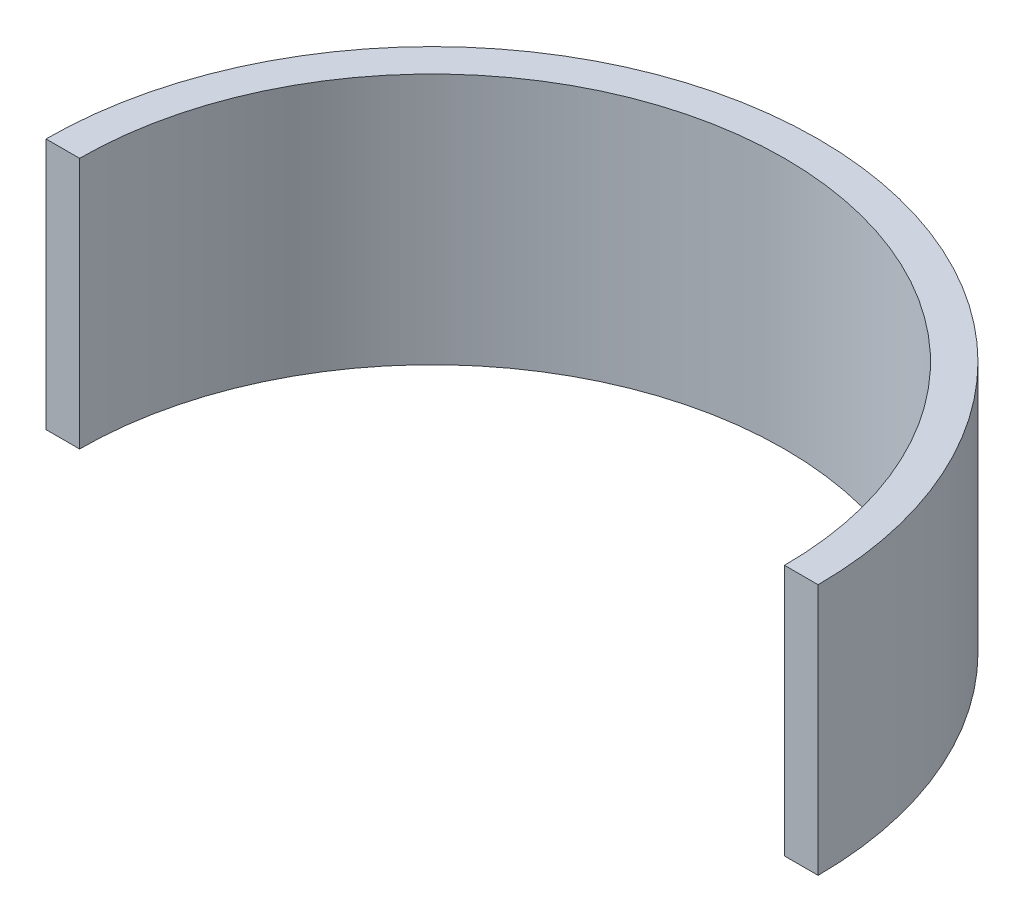
ISO-10303-21;
HEADER;
FILE_DESCRIPTION(('STEP AP214'),'2;1');
FILE_NAME('part.step','',(''),(''),'','','');
FILE_SCHEMA(('AUTOMOTIVE_DESIGN { 1 0 10303 214 1 1 1 1 }'));
ENDSEC;
DATA;
#1=APPLICATION_CONTEXT('core data for automotive mechanical design processes');
#2=APPLICATION_PROTOCOL_DEFINITION('international standard','automotive_design',2000,#1);
#3=PRODUCT_CONTEXT('',#1,'mechanical');
#4=PRODUCT('Part','Part','',(#3));
#5=PRODUCT_RELATED_PRODUCT_CATEGORY('part','',(#4));
#6=PRODUCT_DEFINITION_FORMATION('','',#4);
#7=PRODUCT_DEFINITION_CONTEXT('part definition',#1,'design');
#8=PRODUCT_DEFINITION('design','',#6,#7);
#9=PRODUCT_DEFINITION_SHAPE('','',#8);
#10=(LENGTH_UNIT() NAMED_UNIT(*) SI_UNIT(.MILLI.,.METRE.));
#11=(NAMED_UNIT(*) PLANE_ANGLE_UNIT() SI_UNIT($,.RADIAN.));
#12=(NAMED_UNIT(*) SI_UNIT($,.STERADIAN.) SOLID_ANGLE_UNIT());
#13=UNCERTAINTY_MEASURE_WITH_UNIT(LENGTH_MEASURE(1.E-05),#10,'distance_accuracy_value','');
#14=(GEOMETRIC_REPRESENTATION_CONTEXT(3) GLOBAL_UNCERTAINTY_ASSIGNED_CONTEXT((#13)) GLOBAL_UNIT_ASSIGNED_CONTEXT((#10,
#11,#12)) REPRESENTATION_CONTEXT('',''));
#15=CARTESIAN_POINT('',(0.,0.,0.));
#16=DIRECTION('',(0.,0.,1.));
#17=DIRECTION('',(1.,0.,0.));
#18=AXIS2_PLACEMENT_3D('',#15,#16,#17);
#19=CARTESIAN_POINT('',(0.,30.,0.));
#20=DIRECTION('',(0.,-1.,0.));
#21=DIRECTION('',(0.,0.,-1.));
#22=AXIS2_PLACEMENT_3D('',#19,#20,#21);
#23=CYLINDRICAL_SURFACE('',#22,46.);
#24=CARTESIAN_POINT('',(0.,0.,0.));
#25=DIRECTION('',(0.,1.,0.));
#26=DIRECTION('',(0.,0.,-1.));
#27=AXIS2_PLACEMENT_3D('',#24,#25,#26);
#28=CIRCLE('',#27,46.);
#29=CARTESIAN_POINT('',(46.,0.,0.));
#30=VERTEX_POINT('',#29);
#31=CARTESIAN_POINT('',(-46.,0.,0.));
#32=VERTEX_POINT('',#31);
#33=EDGE_CURVE('E107',#30,#32,#28,.T.);
#34=ORIENTED_EDGE('',*,*,#33,.T.);
#35=DIRECTION('',(0.,-1.,0.));
#36=VECTOR('',#35,1.);
#37=CARTESIAN_POINT('',(-46.,30.,0.));
#38=LINE('',#37,#36);
#39=CARTESIAN_POINT('',(-46.,30.,0.));
#40=VERTEX_POINT('',#39);
#41=EDGE_CURVE('E11',#40,#32,#38,.T.);
#42=ORIENTED_EDGE('',*,*,#41,.F.);
#43=CARTESIAN_POINT('',(0.,30.,0.));
#44=DIRECTION('',(0.,1.,0.));
#45=DIRECTION('',(0.,0.,-1.));
#46=AXIS2_PLACEMENT_3D('',#43,#44,#45);
#47=CIRCLE('',#46,46.);
#48=CARTESIAN_POINT('',(46.,30.,0.));
#49=VERTEX_POINT('',#48);
#50=EDGE_CURVE('E91',#49,#40,#47,.T.);
#51=ORIENTED_EDGE('',*,*,#50,.F.);
#52=DIRECTION('',(0.,-1.,0.));
#53=VECTOR('',#52,1.);
#54=CARTESIAN_POINT('',(46.,30.,0.));
#55=LINE('',#54,#53);
#56=EDGE_CURVE('E103',#49,#30,#55,.T.);
#57=ORIENTED_EDGE('',*,*,#56,.T.);
#58=EDGE_LOOP('',(#34,#42,#51,#57));
#59=FACE_BOUND('',#58,.T.);
#60=ADVANCED_FACE('F39',(#59),#23,.T.);
#61=CARTESIAN_POINT('',(-46.,30.,0.));
#62=DIRECTION('',(0.,0.,-1.));
#63=DIRECTION('',(-1.,0.,0.));
#64=AXIS2_PLACEMENT_3D('',#61,#62,#63);
#65=PLANE('',#64);
#66=DIRECTION('',(1.,0.,0.));
#67=VECTOR('',#66,1.);
#68=CARTESIAN_POINT('',(-46.,0.,0.));
#69=LINE('',#68,#67);
#70=CARTESIAN_POINT('',(-42.,0.,0.));
#71=VERTEX_POINT('',#70);
#72=EDGE_CURVE('E96',#32,#71,#69,.T.);
#73=ORIENTED_EDGE('',*,*,#72,.T.);
#74=DIRECTION('',(0.,-1.,0.));
#75=VECTOR('',#74,1.);
#76=CARTESIAN_POINT('',(-42.,30.,0.));
#77=LINE('',#76,#75);
#78=CARTESIAN_POINT('',(-42.,30.,0.));
#79=VERTEX_POINT('',#78);
#80=EDGE_CURVE('E48',#79,#71,#77,.T.);
#81=ORIENTED_EDGE('',*,*,#80,.F.);
#82=DIRECTION('',(1.,0.,0.));
#83=VECTOR('',#82,1.);
#84=CARTESIAN_POINT('',(-46.,30.,0.));
#85=LINE('',#84,#83);
#86=EDGE_CURVE('E86',#40,#79,#85,.T.);
#87=ORIENTED_EDGE('',*,*,#86,.F.);
#88=ORIENTED_EDGE('',*,*,#41,.T.);
#89=EDGE_LOOP('',(#73,#81,#87,#88));
#90=FACE_BOUND('',#89,.T.);
#91=ADVANCED_FACE('F95',(#90),#65,.F.);
#92=CARTESIAN_POINT('',(0.,30.,0.));
#93=DIRECTION('',(0.,-1.,0.));
#94=DIRECTION('',(0.,0.,-1.));
#95=AXIS2_PLACEMENT_3D('',#92,#93,#94);
#96=CYLINDRICAL_SURFACE('',#95,42.);
#97=CARTESIAN_POINT('',(0.,0.,0.));
#98=DIRECTION('',(0.,-1.,0.));
#99=DIRECTION('',(0.,0.,-1.));
#100=AXIS2_PLACEMENT_3D('',#97,#98,#99);
#101=CIRCLE('',#100,42.);
#102=CARTESIAN_POINT('',(42.,0.,0.));
#103=VERTEX_POINT('',#102);
#104=EDGE_CURVE('E73',#71,#103,#101,.T.);
#105=ORIENTED_EDGE('',*,*,#104,.T.);
#106=DIRECTION('',(0.,-1.,0.));
#107=VECTOR('',#106,1.);
#108=CARTESIAN_POINT('',(42.,30.,0.));
#109=LINE('',#108,#107);
#110=CARTESIAN_POINT('',(42.,30.,0.));
#111=VERTEX_POINT('',#110);
#112=EDGE_CURVE('E98',#111,#103,#109,.T.);
#113=ORIENTED_EDGE('',*,*,#112,.F.);
#114=CARTESIAN_POINT('',(0.,30.,0.));
#115=DIRECTION('',(0.,-1.,0.));
#116=DIRECTION('',(0.,0.,-1.));
#117=AXIS2_PLACEMENT_3D('',#114,#115,#116);
#118=CIRCLE('',#117,42.);
#119=EDGE_CURVE('E89',#79,#111,#118,.T.);
#120=ORIENTED_EDGE('',*,*,#119,.F.);
#121=ORIENTED_EDGE('',*,*,#80,.T.);
#122=EDGE_LOOP('',(#105,#113,#120,#121));
#123=FACE_BOUND('',#122,.T.);
#124=ADVANCED_FACE('F99',(#123),#96,.F.);
#125=CARTESIAN_POINT('',(46.,30.,0.));
#126=DIRECTION('',(0.,0.,-1.));
#127=DIRECTION('',(-1.,0.,0.));
#128=AXIS2_PLACEMENT_3D('',#125,#126,#127);
#129=PLANE('',#128);
#130=DIRECTION('',(1.,0.,0.));
#131=VECTOR('',#130,1.);
#132=CARTESIAN_POINT('',(46.,0.,0.));
#133=LINE('',#132,#131);
#134=EDGE_CURVE('E79',#103,#30,#133,.T.);
#135=ORIENTED_EDGE('',*,*,#134,.T.);
#136=ORIENTED_EDGE('',*,*,#56,.F.);
#137=DIRECTION('',(1.,0.,0.));
#138=VECTOR('',#137,1.);
#139=CARTESIAN_POINT('',(46.,30.,0.));
#140=LINE('',#139,#138);
#141=EDGE_CURVE('E56',#111,#49,#140,.T.);
#142=ORIENTED_EDGE('',*,*,#141,.F.);
#143=ORIENTED_EDGE('',*,*,#112,.T.);
#144=EDGE_LOOP('',(#135,#136,#142,#143));
#145=FACE_BOUND('',#144,.T.);
#146=ADVANCED_FACE('F120',(#145),#129,.F.);
#147=CARTESIAN_POINT('',(0.,30.,0.));
#148=DIRECTION('',(0.,-1.,0.));
#149=DIRECTION('',(0.,0.,-1.));
#150=AXIS2_PLACEMENT_3D('',#147,#148,#149);
#151=PLANE('',#150);
#152=ORIENTED_EDGE('',*,*,#50,.T.);
#153=ORIENTED_EDGE('',*,*,#86,.T.);
#154=ORIENTED_EDGE('',*,*,#119,.T.);
#155=ORIENTED_EDGE('',*,*,#141,.T.);
#156=EDGE_LOOP('',(#152,#153,#154,#155));
#157=FACE_BOUND('',#156,.T.);
#158=ADVANCED_FACE('F87',(#157),#151,.F.);
#159=CARTESIAN_POINT('',(0.,0.,0.));
#160=DIRECTION('',(0.,-1.,0.));
#161=DIRECTION('',(0.,0.,-1.));
#162=AXIS2_PLACEMENT_3D('',#159,#160,#161);
#163=PLANE('',#162);
#164=ORIENTED_EDGE('',*,*,#33,.F.);
#165=ORIENTED_EDGE('',*,*,#134,.F.);
#166=ORIENTED_EDGE('',*,*,#104,.F.);
#167=ORIENTED_EDGE('',*,*,#72,.F.);
#168=EDGE_LOOP('',(#164,#165,#166,#167));
#169=FACE_BOUND('',#168,.T.);
#170=ADVANCED_FACE('F123',(#169),#163,.T.);
#171=CLOSED_SHELL('',(#60,#91,#124,#146,#158,#170));
#172=MANIFOLD_SOLID_BREP('B2',#171);
#173=ADVANCED_BREP_SHAPE_REPRESENTATION('',(#18,#172),#14);
#174=SHAPE_DEFINITION_REPRESENTATION(#9,#173);
ENDSEC;
END-ISO-10303-21;
